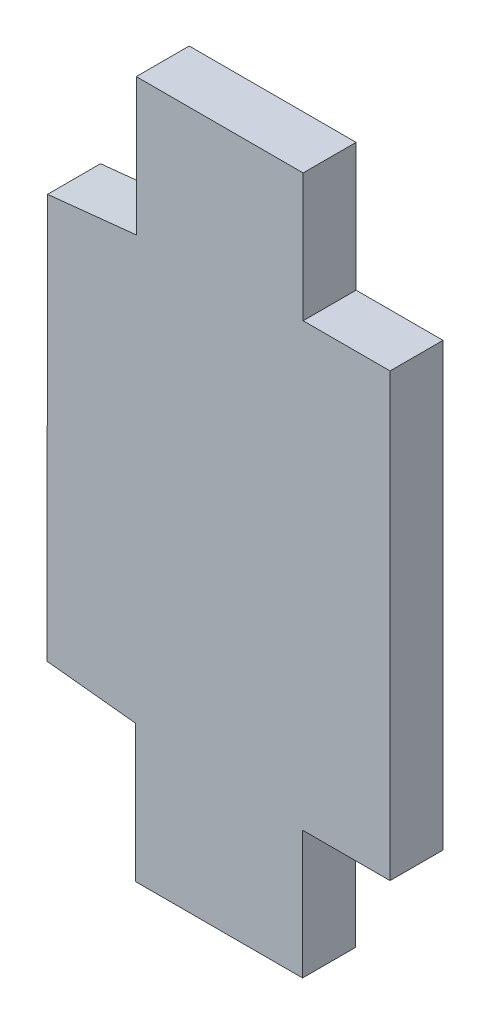
ISO-10303-21;
HEADER;
FILE_DESCRIPTION(('STEP AP214'),'2;1');
FILE_NAME('part.step','',(''),(''),'','','');
FILE_SCHEMA(('AUTOMOTIVE_DESIGN { 1 0 10303 214 1 1 1 1 }'));
ENDSEC;
DATA;
#1=APPLICATION_CONTEXT('core data for automotive mechanical design processes');
#2=APPLICATION_PROTOCOL_DEFINITION('international standard','automotive_design',2000,#1);
#3=PRODUCT_CONTEXT('',#1,'mechanical');
#4=PRODUCT('Part','Part','',(#3));
#5=PRODUCT_RELATED_PRODUCT_CATEGORY('part','',(#4));
#6=PRODUCT_DEFINITION_FORMATION('','',#4);
#7=PRODUCT_DEFINITION_CONTEXT('part definition',#1,'design');
#8=PRODUCT_DEFINITION('design','',#6,#7);
#9=PRODUCT_DEFINITION_SHAPE('','',#8);
#10=(LENGTH_UNIT() NAMED_UNIT(*) SI_UNIT(.MILLI.,.METRE.));
#11=(NAMED_UNIT(*) PLANE_ANGLE_UNIT() SI_UNIT($,.RADIAN.));
#12=(NAMED_UNIT(*) SI_UNIT($,.STERADIAN.) SOLID_ANGLE_UNIT());
#13=UNCERTAINTY_MEASURE_WITH_UNIT(LENGTH_MEASURE(1.E-05),#10,'distance_accuracy_value','');
#14=(GEOMETRIC_REPRESENTATION_CONTEXT(3) GLOBAL_UNCERTAINTY_ASSIGNED_CONTEXT((#13)) GLOBAL_UNIT_ASSIGNED_CONTEXT((#10,
#11,#12)) REPRESENTATION_CONTEXT('',''));
#15=CARTESIAN_POINT('',(0.,0.,0.));
#16=DIRECTION('',(0.,0.,1.));
#17=DIRECTION('',(1.,0.,0.));
#18=AXIS2_PLACEMENT_3D('',#15,#16,#17);
#19=CARTESIAN_POINT('',(668.956474552736,-2.04461862286082,3.));
#20=DIRECTION('',(0.,-1.,0.));
#21=DIRECTION('',(1.,0.,0.));
#22=AXIS2_PLACEMENT_3D('',#19,#20,#21);
#23=PLANE('',#22);
#24=DIRECTION('',(-1.,0.,0.));
#25=VECTOR('',#24,1.);
#26=CARTESIAN_POINT('',(668.956474552736,-2.04461862286082,0.));
#27=LINE('',#26,#25);
#28=CARTESIAN_POINT('',(668.956474552736,-2.04461862286082,0.));
#29=VERTEX_POINT('',#28);
#30=CARTESIAN_POINT('',(664.033668516425,-2.04461862286084,0.));
#31=VERTEX_POINT('',#30);
#32=EDGE_CURVE('E124',#29,#31,#27,.T.);
#33=ORIENTED_EDGE('',*,*,#32,.T.);
#34=DIRECTION('',(0.,0.,-1.));
#35=VECTOR('',#34,1.);
#36=CARTESIAN_POINT('',(664.033668516425,-2.04461862286084,3.));
#37=LINE('',#36,#35);
#38=CARTESIAN_POINT('',(664.033668516425,-2.04461862286084,3.));
#39=VERTEX_POINT('',#38);
#40=EDGE_CURVE('E11',#39,#31,#37,.T.);
#41=ORIENTED_EDGE('',*,*,#40,.F.);
#42=DIRECTION('',(-1.,0.,0.));
#43=VECTOR('',#42,1.);
#44=CARTESIAN_POINT('',(668.956474552736,-2.04461862286082,3.));
#45=LINE('',#44,#43);
#46=CARTESIAN_POINT('',(668.956474552736,-2.04461862286082,3.));
#47=VERTEX_POINT('',#46);
#48=EDGE_CURVE('E159',#47,#39,#45,.T.);
#49=ORIENTED_EDGE('',*,*,#48,.F.);
#50=DIRECTION('',(0.,0.,-1.));
#51=VECTOR('',#50,1.);
#52=CARTESIAN_POINT('',(668.956474552736,-2.04461862286082,3.));
#53=LINE('',#52,#51);
#54=EDGE_CURVE('E137',#47,#29,#53,.T.);
#55=ORIENTED_EDGE('',*,*,#54,.T.);
#56=EDGE_LOOP('',(#33,#41,#49,#55));
#57=FACE_BOUND('',#56,.T.);
#58=ADVANCED_FACE('F32',(#57),#23,.F.);
#59=CARTESIAN_POINT('',(664.033668516425,-2.04461862286084,3.));
#60=DIRECTION('',(-1.,0.,0.));
#61=DIRECTION('',(0.,0.,1.));
#62=AXIS2_PLACEMENT_3D('',#59,#60,#61);
#63=PLANE('',#62);
#64=DIRECTION('',(0.,1.,0.));
#65=VECTOR('',#64,1.);
#66=CARTESIAN_POINT('',(664.033668516425,-2.04461862286084,0.));
#67=LINE('',#66,#65);
#68=CARTESIAN_POINT('',(664.033668516425,5.20538137713916,0.));
#69=VERTEX_POINT('',#68);
#70=EDGE_CURVE('E120',#31,#69,#67,.T.);
#71=ORIENTED_EDGE('',*,*,#70,.T.);
#72=DIRECTION('',(0.,0.,-1.));
#73=VECTOR('',#72,1.);
#74=CARTESIAN_POINT('',(664.033668516425,5.20538137713916,3.));
#75=LINE('',#74,#73);
#76=CARTESIAN_POINT('',(664.033668516425,5.20538137713916,3.));
#77=VERTEX_POINT('',#76);
#78=EDGE_CURVE('E39',#77,#69,#75,.T.);
#79=ORIENTED_EDGE('',*,*,#78,.F.);
#80=DIRECTION('',(0.,1.,0.));
#81=VECTOR('',#80,1.);
#82=CARTESIAN_POINT('',(664.033668516425,-2.04461862286084,3.));
#83=LINE('',#82,#81);
#84=EDGE_CURVE('E133',#39,#77,#83,.T.);
#85=ORIENTED_EDGE('',*,*,#84,.F.);
#86=ORIENTED_EDGE('',*,*,#40,.T.);
#87=EDGE_LOOP('',(#71,#79,#85,#86));
#88=FACE_BOUND('',#87,.T.);
#89=ADVANCED_FACE('F132',(#88),#63,.F.);
#90=CARTESIAN_POINT('',(664.033668516425,5.20538137713916,3.));
#91=DIRECTION('',(0.,-1.,0.));
#92=DIRECTION('',(1.,0.,0.));
#93=AXIS2_PLACEMENT_3D('',#90,#91,#92);
#94=PLANE('',#93);
#95=DIRECTION('',(-1.,0.,0.));
#96=VECTOR('',#95,1.);
#97=CARTESIAN_POINT('',(664.033668516425,5.20538137713916,0.));
#98=LINE('',#97,#96);
#99=CARTESIAN_POINT('',(654.583668516425,5.20538137713916,0.));
#100=VERTEX_POINT('',#99);
#101=EDGE_CURVE('E126',#69,#100,#98,.T.);
#102=ORIENTED_EDGE('',*,*,#101,.T.);
#103=DIRECTION('',(0.,0.,-1.));
#104=VECTOR('',#103,1.);
#105=CARTESIAN_POINT('',(654.583668516425,5.20538137713916,3.));
#106=LINE('',#105,#104);
#107=CARTESIAN_POINT('',(654.583668516425,5.20538137713916,3.));
#108=VERTEX_POINT('',#107);
#109=EDGE_CURVE('E205',#108,#100,#106,.T.);
#110=ORIENTED_EDGE('',*,*,#109,.F.);
#111=DIRECTION('',(-1.,0.,0.));
#112=VECTOR('',#111,1.);
#113=CARTESIAN_POINT('',(664.033668516425,5.20538137713916,3.));
#114=LINE('',#113,#112);
#115=EDGE_CURVE('E162',#77,#108,#114,.T.);
#116=ORIENTED_EDGE('',*,*,#115,.F.);
#117=ORIENTED_EDGE('',*,*,#78,.T.);
#118=EDGE_LOOP('',(#102,#110,#116,#117));
#119=FACE_BOUND('',#118,.T.);
#120=ADVANCED_FACE('F209',(#119),#94,.F.);
#121=CARTESIAN_POINT('',(654.583668516425,-2.55952404280784,3.));
#122=DIRECTION('',(1.,0.,0.));
#123=DIRECTION('',(0.,1.,0.));
#124=AXIS2_PLACEMENT_3D('',#121,#122,#123);
#125=PLANE('',#124);
#126=DIRECTION('',(0.,-1.,0.));
#127=VECTOR('',#126,1.);
#128=CARTESIAN_POINT('',(654.583668516425,-2.55952404280784,0.));
#129=LINE('',#128,#127);
#130=CARTESIAN_POINT('',(654.583668516425,-2.55952404280784,0.));
#131=VERTEX_POINT('',#130);
#132=EDGE_CURVE('E141',#100,#131,#129,.T.);
#133=ORIENTED_EDGE('',*,*,#132,.T.);
#134=DIRECTION('',(0.,0.,-1.));
#135=VECTOR('',#134,1.);
#136=CARTESIAN_POINT('',(654.583668516425,-2.55952404280784,3.));
#137=LINE('',#136,#135);
#138=CARTESIAN_POINT('',(654.583668516425,-2.55952404280784,3.));
#139=VERTEX_POINT('',#138);
#140=EDGE_CURVE('E202',#139,#131,#137,.T.);
#141=ORIENTED_EDGE('',*,*,#140,.F.);
#142=DIRECTION('',(0.,-1.,0.));
#143=VECTOR('',#142,1.);
#144=CARTESIAN_POINT('',(654.583668516425,-2.55952404280784,3.));
#145=LINE('',#144,#143);
#146=EDGE_CURVE('E164',#108,#139,#145,.T.);
#147=ORIENTED_EDGE('',*,*,#146,.F.);
#148=ORIENTED_EDGE('',*,*,#109,.T.);
#149=EDGE_LOOP('',(#133,#141,#147,#148));
#150=FACE_BOUND('',#149,.T.);
#151=ADVANCED_FACE('F217',(#150),#125,.F.);
#152=CARTESIAN_POINT('',(654.583668516425,-2.55952404280784,3.));
#153=DIRECTION('',(0.103207966273551,-0.994659798975347,0.));
#154=DIRECTION('',(0.994659798975347,0.103207966273551,0.));
#155=AXIS2_PLACEMENT_3D('',#152,#153,#154);
#156=PLANE('',#155);
#157=DIRECTION('',(-0.994659798975347,-0.103207966273551,0.));
#158=VECTOR('',#157,1.);
#159=CARTESIAN_POINT('',(654.583668516425,-2.55952404280784,0.));
#160=LINE('',#159,#158);
#161=CARTESIAN_POINT('',(649.557637685166,-3.08103543902261,0.));
#162=VERTEX_POINT('',#161);
#163=EDGE_CURVE('E143',#131,#162,#160,.T.);
#164=ORIENTED_EDGE('',*,*,#163,.T.);
#165=DIRECTION('',(0.,0.,-1.));
#166=VECTOR('',#165,1.);
#167=CARTESIAN_POINT('',(649.557637685166,-3.08103543902261,3.));
#168=LINE('',#167,#166);
#169=CARTESIAN_POINT('',(649.557637685166,-3.08103543902261,3.));
#170=VERTEX_POINT('',#169);
#171=EDGE_CURVE('E199',#170,#162,#168,.T.);
#172=ORIENTED_EDGE('',*,*,#171,.F.);
#173=DIRECTION('',(-0.994659798975347,-0.103207966273551,0.));
#174=VECTOR('',#173,1.);
#175=CARTESIAN_POINT('',(654.583668516425,-2.55952404280784,3.));
#176=LINE('',#175,#174);
#177=EDGE_CURVE('E166',#139,#170,#176,.T.);
#178=ORIENTED_EDGE('',*,*,#177,.F.);
#179=ORIENTED_EDGE('',*,*,#140,.T.);
#180=EDGE_LOOP('',(#164,#172,#178,#179));
#181=FACE_BOUND('',#180,.T.);
#182=ADVANCED_FACE('F220',(#181),#156,.F.);
#183=CARTESIAN_POINT('',(649.557637685166,-3.08103543902261,3.));
#184=DIRECTION('',(0.999999118635142,-0.00132767802552348,0.));
#185=DIRECTION('',(0.00132767802552348,0.999999118635142,0.));
#186=AXIS2_PLACEMENT_3D('',#183,#184,#185);
#187=PLANE('',#186);
#188=DIRECTION('',(-0.00132767802552348,-0.999999118635142,0.));
#189=VECTOR('',#188,1.);
#190=CARTESIAN_POINT('',(649.557637685166,-3.08103543902261,0.));
#191=LINE('',#190,#189);
#192=CARTESIAN_POINT('',(649.527213056056,-25.9966834426016,0.));
#193=VERTEX_POINT('',#192);
#194=EDGE_CURVE('E145',#162,#193,#191,.T.);
#195=ORIENTED_EDGE('',*,*,#194,.T.);
#196=DIRECTION('',(0.,0.,-1.));
#197=VECTOR('',#196,1.);
#198=CARTESIAN_POINT('',(649.527213056056,-25.9966834426016,3.));
#199=LINE('',#198,#197);
#200=CARTESIAN_POINT('',(649.527213056056,-25.9966834426016,3.));
#201=VERTEX_POINT('',#200);
#202=EDGE_CURVE('E196',#201,#193,#199,.T.);
#203=ORIENTED_EDGE('',*,*,#202,.F.);
#204=DIRECTION('',(-0.00132767802552348,-0.999999118635142,0.));
#205=VECTOR('',#204,1.);
#206=CARTESIAN_POINT('',(649.557637685166,-3.08103543902261,3.));
#207=LINE('',#206,#205);
#208=EDGE_CURVE('E168',#170,#201,#207,.T.);
#209=ORIENTED_EDGE('',*,*,#208,.F.);
#210=ORIENTED_EDGE('',*,*,#171,.T.);
#211=EDGE_LOOP('',(#195,#203,#209,#210));
#212=FACE_BOUND('',#211,.T.);
#213=ADVANCED_FACE('F225',(#212),#187,.F.);
#214=CARTESIAN_POINT('',(654.551841371033,-26.5315388898679,3.));
#215=DIRECTION('',(0.105848776006328,0.994382238687901,0.));
#216=DIRECTION('',(-0.994382238687901,0.105848776006328,0.));
#217=AXIS2_PLACEMENT_3D('',#214,#215,#216);
#218=PLANE('',#217);
#219=DIRECTION('',(0.994382238687901,-0.105848776006328,0.));
#220=VECTOR('',#219,1.);
#221=CARTESIAN_POINT('',(654.551841371033,-26.5315388898679,0.));
#222=LINE('',#221,#220);
#223=CARTESIAN_POINT('',(654.551841371033,-26.5315388898679,0.));
#224=VERTEX_POINT('',#223);
#225=EDGE_CURVE('E147',#193,#224,#222,.T.);
#226=ORIENTED_EDGE('',*,*,#225,.T.);
#227=DIRECTION('',(0.,0.,-1.));
#228=VECTOR('',#227,1.);
#229=CARTESIAN_POINT('',(654.551841371033,-26.5315388898679,3.));
#230=LINE('',#229,#228);
#231=CARTESIAN_POINT('',(654.551841371033,-26.5315388898679,3.));
#232=VERTEX_POINT('',#231);
#233=EDGE_CURVE('E193',#232,#224,#230,.T.);
#234=ORIENTED_EDGE('',*,*,#233,.F.);
#235=DIRECTION('',(0.994382238687901,-0.105848776006328,0.));
#236=VECTOR('',#235,1.);
#237=CARTESIAN_POINT('',(654.551841371033,-26.5315388898679,3.));
#238=LINE('',#237,#236);
#239=EDGE_CURVE('E170',#201,#232,#238,.T.);
#240=ORIENTED_EDGE('',*,*,#239,.F.);
#241=ORIENTED_EDGE('',*,*,#202,.T.);
#242=EDGE_LOOP('',(#226,#234,#240,#241));
#243=FACE_BOUND('',#242,.T.);
#244=ADVANCED_FACE('F231',(#243),#218,.F.);
#245=CARTESIAN_POINT('',(654.551841371033,-26.5315388898679,3.));
#246=DIRECTION('',(1.,0.,0.));
#247=DIRECTION('',(0.,0.,-1.));
#248=AXIS2_PLACEMENT_3D('',#245,#246,#247);
#249=PLANE('',#248);
#250=DIRECTION('',(0.,-1.,0.));
#251=VECTOR('',#250,1.);
#252=CARTESIAN_POINT('',(654.551841371033,-26.5315388898679,0.));
#253=LINE('',#252,#251);
#254=CARTESIAN_POINT('',(654.551841371033,-34.2964443098149,0.));
#255=VERTEX_POINT('',#254);
#256=EDGE_CURVE('E149',#224,#255,#253,.T.);
#257=ORIENTED_EDGE('',*,*,#256,.T.);
#258=DIRECTION('',(0.,0.,-1.));
#259=VECTOR('',#258,1.);
#260=CARTESIAN_POINT('',(654.551841371033,-34.2964443098149,3.));
#261=LINE('',#260,#259);
#262=CARTESIAN_POINT('',(654.551841371033,-34.2964443098149,3.));
#263=VERTEX_POINT('',#262);
#264=EDGE_CURVE('E190',#263,#255,#261,.T.);
#265=ORIENTED_EDGE('',*,*,#264,.F.);
#266=DIRECTION('',(0.,-1.,0.));
#267=VECTOR('',#266,1.);
#268=CARTESIAN_POINT('',(654.551841371033,-26.5315388898679,3.));
#269=LINE('',#268,#267);
#270=EDGE_CURVE('E172',#232,#263,#269,.T.);
#271=ORIENTED_EDGE('',*,*,#270,.F.);
#272=ORIENTED_EDGE('',*,*,#233,.T.);
#273=EDGE_LOOP('',(#257,#265,#271,#272));
#274=FACE_BOUND('',#273,.T.);
#275=ADVANCED_FACE('F235',(#274),#249,.F.);
#276=CARTESIAN_POINT('',(664.001841371033,-34.2964443098149,3.));
#277=DIRECTION('',(0.,1.,0.));
#278=DIRECTION('',(0.,0.,1.));
#279=AXIS2_PLACEMENT_3D('',#276,#277,#278);
#280=PLANE('',#279);
#281=DIRECTION('',(1.,0.,0.));
#282=VECTOR('',#281,1.);
#283=CARTESIAN_POINT('',(664.001841371033,-34.2964443098149,0.));
#284=LINE('',#283,#282);
#285=CARTESIAN_POINT('',(664.001841371033,-34.2964443098149,0.));
#286=VERTEX_POINT('',#285);
#287=EDGE_CURVE('E151',#255,#286,#284,.T.);
#288=ORIENTED_EDGE('',*,*,#287,.T.);
#289=DIRECTION('',(0.,0.,-1.));
#290=VECTOR('',#289,1.);
#291=CARTESIAN_POINT('',(664.001841371033,-34.2964443098149,3.));
#292=LINE('',#291,#290);
#293=CARTESIAN_POINT('',(664.001841371033,-34.2964443098149,3.));
#294=VERTEX_POINT('',#293);
#295=EDGE_CURVE('E187',#294,#286,#292,.T.);
#296=ORIENTED_EDGE('',*,*,#295,.F.);
#297=DIRECTION('',(1.,0.,0.));
#298=VECTOR('',#297,1.);
#299=CARTESIAN_POINT('',(664.001841371033,-34.2964443098149,3.));
#300=LINE('',#299,#298);
#301=EDGE_CURVE('E174',#263,#294,#300,.T.);
#302=ORIENTED_EDGE('',*,*,#301,.F.);
#303=ORIENTED_EDGE('',*,*,#264,.T.);
#304=EDGE_LOOP('',(#288,#296,#302,#303));
#305=FACE_BOUND('',#304,.T.);
#306=ADVANCED_FACE('F240',(#305),#280,.F.);
#307=CARTESIAN_POINT('',(664.001841371033,-27.0446186228608,3.));
#308=DIRECTION('',(-1.,0.,0.));
#309=DIRECTION('',(0.,0.,1.));
#310=AXIS2_PLACEMENT_3D('',#307,#308,#309);
#311=PLANE('',#310);
#312=DIRECTION('',(0.,1.,0.));
#313=VECTOR('',#312,1.);
#314=CARTESIAN_POINT('',(664.001841371033,-27.0446186228608,0.));
#315=LINE('',#314,#313);
#316=CARTESIAN_POINT('',(664.001841371033,-27.0446186228608,0.));
#317=VERTEX_POINT('',#316);
#318=EDGE_CURVE('E153',#286,#317,#315,.T.);
#319=ORIENTED_EDGE('',*,*,#318,.T.);
#320=DIRECTION('',(0.,0.,-1.));
#321=VECTOR('',#320,1.);
#322=CARTESIAN_POINT('',(664.001841371033,-27.0446186228608,3.));
#323=LINE('',#322,#321);
#324=CARTESIAN_POINT('',(664.001841371033,-27.0446186228608,3.));
#325=VERTEX_POINT('',#324);
#326=EDGE_CURVE('E184',#325,#317,#323,.T.);
#327=ORIENTED_EDGE('',*,*,#326,.F.);
#328=DIRECTION('',(0.,1.,0.));
#329=VECTOR('',#328,1.);
#330=CARTESIAN_POINT('',(664.001841371033,-27.0446186228608,3.));
#331=LINE('',#330,#329);
#332=EDGE_CURVE('E176',#294,#325,#331,.T.);
#333=ORIENTED_EDGE('',*,*,#332,.F.);
#334=ORIENTED_EDGE('',*,*,#295,.T.);
#335=EDGE_LOOP('',(#319,#327,#333,#334));
#336=FACE_BOUND('',#335,.T.);
#337=ADVANCED_FACE('F244',(#336),#311,.F.);
#338=CARTESIAN_POINT('',(668.956474552736,-27.0446186228608,3.));
#339=DIRECTION('',(0.,1.,0.));
#340=DIRECTION('',(-1.,0.,0.));
#341=AXIS2_PLACEMENT_3D('',#338,#339,#340);
#342=PLANE('',#341);
#343=DIRECTION('',(1.,0.,0.));
#344=VECTOR('',#343,1.);
#345=CARTESIAN_POINT('',(668.956474552736,-27.0446186228608,0.));
#346=LINE('',#345,#344);
#347=CARTESIAN_POINT('',(668.956474552736,-27.0446186228608,0.));
#348=VERTEX_POINT('',#347);
#349=EDGE_CURVE('E155',#317,#348,#346,.T.);
#350=ORIENTED_EDGE('',*,*,#349,.T.);
#351=DIRECTION('',(0.,0.,-1.));
#352=VECTOR('',#351,1.);
#353=CARTESIAN_POINT('',(668.956474552736,-27.0446186228608,3.));
#354=LINE('',#353,#352);
#355=CARTESIAN_POINT('',(668.956474552736,-27.0446186228608,3.));
#356=VERTEX_POINT('',#355);
#357=EDGE_CURVE('E181',#356,#348,#354,.T.);
#358=ORIENTED_EDGE('',*,*,#357,.F.);
#359=DIRECTION('',(1.,0.,0.));
#360=VECTOR('',#359,1.);
#361=CARTESIAN_POINT('',(668.956474552736,-27.0446186228608,3.));
#362=LINE('',#361,#360);
#363=EDGE_CURVE('E51',#325,#356,#362,.T.);
#364=ORIENTED_EDGE('',*,*,#363,.F.);
#365=ORIENTED_EDGE('',*,*,#326,.T.);
#366=EDGE_LOOP('',(#350,#358,#364,#365));
#367=FACE_BOUND('',#366,.T.);
#368=ADVANCED_FACE('F248',(#367),#342,.F.);
#369=CARTESIAN_POINT('',(668.956474552736,-27.0446186228608,3.));
#370=DIRECTION('',(-1.,0.,0.));
#371=DIRECTION('',(0.,0.,1.));
#372=AXIS2_PLACEMENT_3D('',#369,#370,#371);
#373=PLANE('',#372);
#374=DIRECTION('',(0.,1.,0.));
#375=VECTOR('',#374,1.);
#376=CARTESIAN_POINT('',(668.956474552736,-27.0446186228608,0.));
#377=LINE('',#376,#375);
#378=EDGE_CURVE('E157',#348,#29,#377,.T.);
#379=ORIENTED_EDGE('',*,*,#378,.T.);
#380=ORIENTED_EDGE('',*,*,#54,.F.);
#381=DIRECTION('',(0.,1.,0.));
#382=VECTOR('',#381,1.);
#383=CARTESIAN_POINT('',(668.956474552736,-27.0446186228608,3.));
#384=LINE('',#383,#382);
#385=EDGE_CURVE('E46',#356,#47,#384,.T.);
#386=ORIENTED_EDGE('',*,*,#385,.F.);
#387=ORIENTED_EDGE('',*,*,#357,.T.);
#388=EDGE_LOOP('',(#379,#380,#386,#387));
#389=FACE_BOUND('',#388,.T.);
#390=ADVANCED_FACE('F250',(#389),#373,.F.);
#391=CARTESIAN_POINT('',(664.033668516425,-2.04461862286084,3.));
#392=DIRECTION('',(0.,0.,-1.));
#393=DIRECTION('',(-1.,0.,0.));
#394=AXIS2_PLACEMENT_3D('',#391,#392,#393);
#395=PLANE('',#394);
#396=ORIENTED_EDGE('',*,*,#48,.T.);
#397=ORIENTED_EDGE('',*,*,#84,.T.);
#398=ORIENTED_EDGE('',*,*,#115,.T.);
#399=ORIENTED_EDGE('',*,*,#146,.T.);
#400=ORIENTED_EDGE('',*,*,#177,.T.);
#401=ORIENTED_EDGE('',*,*,#208,.T.);
#402=ORIENTED_EDGE('',*,*,#239,.T.);
#403=ORIENTED_EDGE('',*,*,#270,.T.);
#404=ORIENTED_EDGE('',*,*,#301,.T.);
#405=ORIENTED_EDGE('',*,*,#332,.T.);
#406=ORIENTED_EDGE('',*,*,#363,.T.);
#407=ORIENTED_EDGE('',*,*,#385,.T.);
#408=EDGE_LOOP('',(#396,#397,#398,#399,#400,#401,#402,#403,#404,#405,#406,#407));
#409=FACE_BOUND('',#408,.T.);
#410=ADVANCED_FACE('F212',(#409),#395,.F.);
#411=CARTESIAN_POINT('',(664.033668516425,-2.04461862286084,0.));
#412=DIRECTION('',(0.,0.,-1.));
#413=DIRECTION('',(-1.,0.,0.));
#414=AXIS2_PLACEMENT_3D('',#411,#412,#413);
#415=PLANE('',#414);
#416=ORIENTED_EDGE('',*,*,#32,.F.);
#417=ORIENTED_EDGE('',*,*,#378,.F.);
#418=ORIENTED_EDGE('',*,*,#349,.F.);
#419=ORIENTED_EDGE('',*,*,#318,.F.);
#420=ORIENTED_EDGE('',*,*,#287,.F.);
#421=ORIENTED_EDGE('',*,*,#256,.F.);
#422=ORIENTED_EDGE('',*,*,#225,.F.);
#423=ORIENTED_EDGE('',*,*,#194,.F.);
#424=ORIENTED_EDGE('',*,*,#163,.F.);
#425=ORIENTED_EDGE('',*,*,#132,.F.);
#426=ORIENTED_EDGE('',*,*,#101,.F.);
#427=ORIENTED_EDGE('',*,*,#70,.F.);
#428=EDGE_LOOP('',(#416,#417,#418,#419,#420,#421,#422,#423,#424,#425,#426,#427));
#429=FACE_BOUND('',#428,.T.);
#430=ADVANCED_FACE('F121',(#429),#415,.T.);
#431=CLOSED_SHELL('',(#58,#89,#120,#151,#182,#213,#244,#275,#306,#337,#368,#390,#410,#430));
#432=MANIFOLD_SOLID_BREP('B2',#431);
#433=ADVANCED_BREP_SHAPE_REPRESENTATION('',(#18,#432),#14);
#434=SHAPE_DEFINITION_REPRESENTATION(#9,#433);
ENDSEC;
END-ISO-10303-21;
